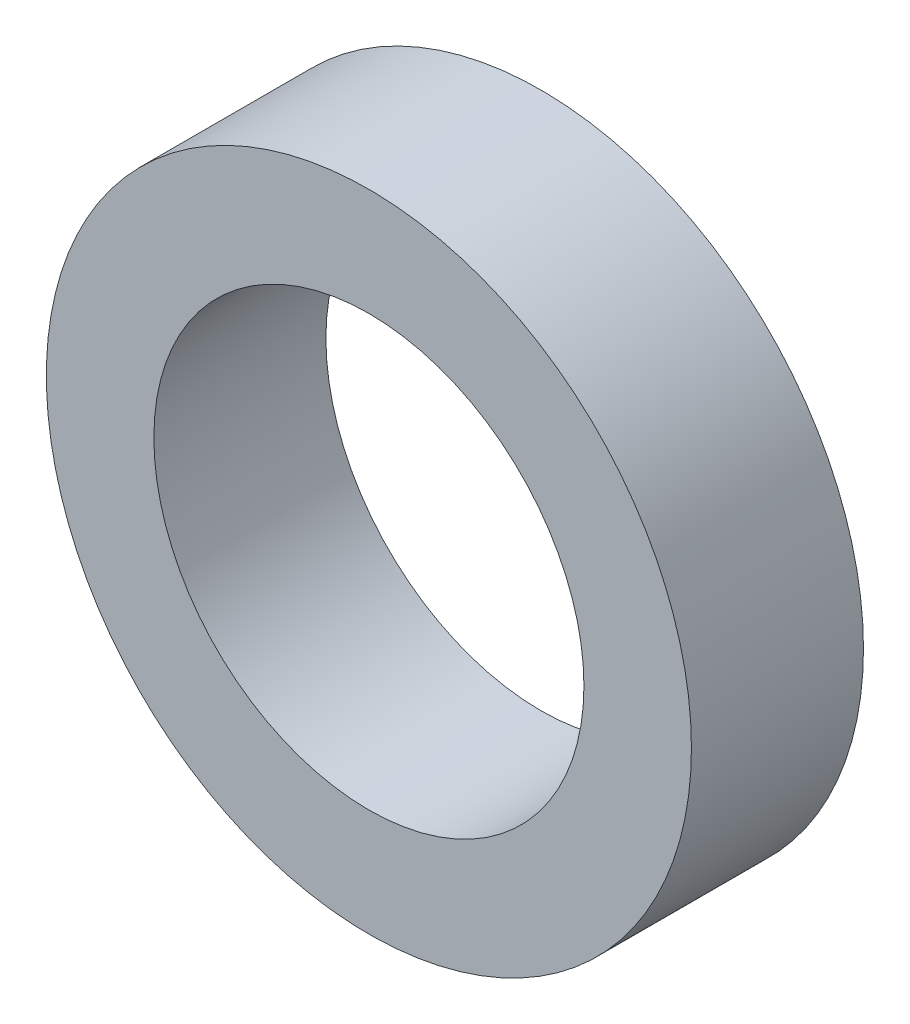
ISO-10303-21;
HEADER;
FILE_DESCRIPTION(('STEP AP214'),'2;1');
FILE_NAME('part.step','',(''),(''),'','','');
FILE_SCHEMA(('AUTOMOTIVE_DESIGN { 1 0 10303 214 1 1 1 1 }'));
ENDSEC;
DATA;
#1=APPLICATION_CONTEXT('core data for automotive mechanical design processes');
#2=APPLICATION_PROTOCOL_DEFINITION('international standard','automotive_design',2000,#1);
#3=PRODUCT_CONTEXT('',#1,'mechanical');
#4=PRODUCT('Part','Part','',(#3));
#5=PRODUCT_RELATED_PRODUCT_CATEGORY('part','',(#4));
#6=PRODUCT_DEFINITION_FORMATION('','',#4);
#7=PRODUCT_DEFINITION_CONTEXT('part definition',#1,'design');
#8=PRODUCT_DEFINITION('design','',#6,#7);
#9=PRODUCT_DEFINITION_SHAPE('','',#8);
#10=(LENGTH_UNIT() NAMED_UNIT(*) SI_UNIT(.MILLI.,.METRE.));
#11=(NAMED_UNIT(*) PLANE_ANGLE_UNIT() SI_UNIT($,.RADIAN.));
#12=(NAMED_UNIT(*) SI_UNIT($,.STERADIAN.) SOLID_ANGLE_UNIT());
#13=UNCERTAINTY_MEASURE_WITH_UNIT(LENGTH_MEASURE(1.E-05),#10,'distance_accuracy_value','');
#14=(GEOMETRIC_REPRESENTATION_CONTEXT(3) GLOBAL_UNCERTAINTY_ASSIGNED_CONTEXT((#13)) GLOBAL_UNIT_ASSIGNED_CONTEXT((#10,
#11,#12)) REPRESENTATION_CONTEXT('',''));
#15=CARTESIAN_POINT('',(0.,0.,0.));
#16=DIRECTION('',(0.,0.,1.));
#17=DIRECTION('',(1.,0.,0.));
#18=AXIS2_PLACEMENT_3D('',#15,#16,#17);
#19=CARTESIAN_POINT('',(0.,0.,4.));
#20=DIRECTION('',(0.,0.,1.));
#21=DIRECTION('',(1.,0.,0.));
#22=AXIS2_PLACEMENT_3D('',#19,#20,#21);
#23=PLANE('',#22);
#24=CARTESIAN_POINT('',(0.,0.,4.));
#25=DIRECTION('',(0.,0.,1.));
#26=DIRECTION('',(1.,0.,0.));
#27=AXIS2_PLACEMENT_3D('',#24,#25,#26);
#28=CIRCLE('',#27,7.5);
#29=CARTESIAN_POINT('',(7.5,0.,4.));
#30=VERTEX_POINT('',#29);
#31=EDGE_CURVE('E10',#30,#30,#28,.T.);
#32=ORIENTED_EDGE('',*,*,#31,.T.);
#33=EDGE_LOOP('',(#32));
#34=FACE_BOUND('',#33,.T.);
#35=CARTESIAN_POINT('',(0.,0.,4.));
#36=DIRECTION('',(0.,0.,1.));
#37=DIRECTION('',(1.,0.,0.));
#38=AXIS2_PLACEMENT_3D('',#35,#36,#37);
#39=CIRCLE('',#38,5.);
#40=CARTESIAN_POINT('',(5.,0.,4.));
#41=VERTEX_POINT('',#40);
#42=EDGE_CURVE('E52',#41,#41,#39,.T.);
#43=ORIENTED_EDGE('',*,*,#42,.F.);
#44=EDGE_LOOP('',(#43));
#45=FACE_BOUND('',#44,.T.);
#46=ADVANCED_FACE('F41',(#34,#45),#23,.T.);
#47=CARTESIAN_POINT('',(0.,0.,0.));
#48=DIRECTION('',(0.,0.,1.));
#49=DIRECTION('',(1.,0.,0.));
#50=AXIS2_PLACEMENT_3D('',#47,#48,#49);
#51=PLANE('',#50);
#52=CARTESIAN_POINT('',(0.,0.,0.));
#53=DIRECTION('',(0.,0.,1.));
#54=DIRECTION('',(1.,0.,0.));
#55=AXIS2_PLACEMENT_3D('',#52,#53,#54);
#56=CIRCLE('',#55,7.5);
#57=CARTESIAN_POINT('',(7.5,0.,0.));
#58=VERTEX_POINT('',#57);
#59=EDGE_CURVE('E45',#58,#58,#56,.T.);
#60=ORIENTED_EDGE('',*,*,#59,.F.);
#61=EDGE_LOOP('',(#60));
#62=FACE_BOUND('',#61,.T.);
#63=CARTESIAN_POINT('',(0.,0.,0.));
#64=DIRECTION('',(0.,0.,1.));
#65=DIRECTION('',(1.,0.,0.));
#66=AXIS2_PLACEMENT_3D('',#63,#64,#65);
#67=CIRCLE('',#66,5.);
#68=CARTESIAN_POINT('',(5.,0.,0.));
#69=VERTEX_POINT('',#68);
#70=EDGE_CURVE('E54',#69,#69,#67,.T.);
#71=ORIENTED_EDGE('',*,*,#70,.T.);
#72=EDGE_LOOP('',(#71));
#73=FACE_BOUND('',#72,.T.);
#74=ADVANCED_FACE('F64',(#62,#73),#51,.F.);
#75=CARTESIAN_POINT('',(0.,0.,4.));
#76=DIRECTION('',(0.,0.,-1.));
#77=DIRECTION('',(-1.,0.,0.));
#78=AXIS2_PLACEMENT_3D('',#75,#76,#77);
#79=CYLINDRICAL_SURFACE('',#78,7.5);
#80=ORIENTED_EDGE('',*,*,#31,.F.);
#81=EDGE_LOOP('',(#80));
#82=FACE_BOUND('',#81,.T.);
#83=ORIENTED_EDGE('',*,*,#59,.T.);
#84=EDGE_LOOP('',(#83));
#85=FACE_BOUND('',#84,.T.);
#86=ADVANCED_FACE('F43',(#82,#85),#79,.T.);
#87=CARTESIAN_POINT('',(0.,0.,4.));
#88=DIRECTION('',(0.,0.,-1.));
#89=DIRECTION('',(-1.,0.,0.));
#90=AXIS2_PLACEMENT_3D('',#87,#88,#89);
#91=CYLINDRICAL_SURFACE('',#90,5.);
#92=ORIENTED_EDGE('',*,*,#42,.T.);
#93=EDGE_LOOP('',(#92));
#94=FACE_BOUND('',#93,.T.);
#95=ORIENTED_EDGE('',*,*,#70,.F.);
#96=EDGE_LOOP('',(#95));
#97=FACE_BOUND('',#96,.T.);
#98=ADVANCED_FACE('F60',(#94,#97),#91,.F.);
#99=CLOSED_SHELL('',(#46,#74,#86,#98));
#100=MANIFOLD_SOLID_BREP('B2',#99);
#101=ADVANCED_BREP_SHAPE_REPRESENTATION('',(#18,#100),#14);
#102=SHAPE_DEFINITION_REPRESENTATION(#9,#101);
ENDSEC;
END-ISO-10303-21;
